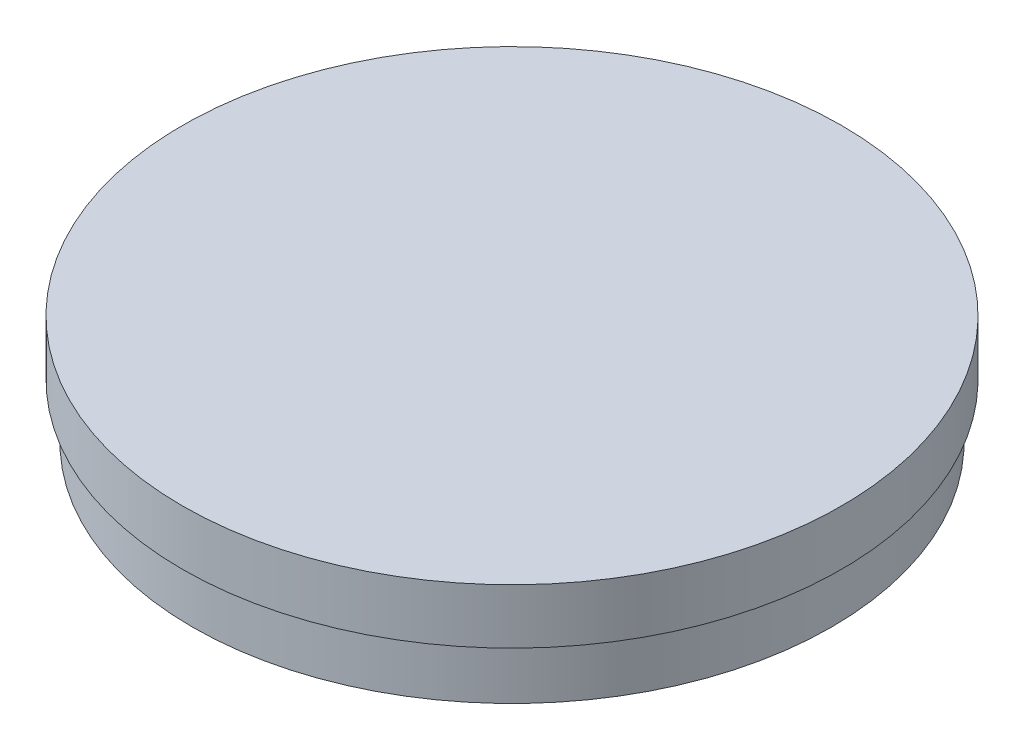
ISO-10303-21;
HEADER;
FILE_DESCRIPTION(('STEP AP214'),'2;1');
FILE_NAME('part.step','',(''),(''),'','','');
FILE_SCHEMA(('AUTOMOTIVE_DESIGN { 1 0 10303 214 1 1 1 1 }'));
ENDSEC;
DATA;
#1=APPLICATION_CONTEXT('core data for automotive mechanical design processes');
#2=APPLICATION_PROTOCOL_DEFINITION('international standard','automotive_design',2000,#1);
#3=PRODUCT_CONTEXT('',#1,'mechanical');
#4=PRODUCT('Part','Part','',(#3));
#5=PRODUCT_RELATED_PRODUCT_CATEGORY('part','',(#4));
#6=PRODUCT_DEFINITION_FORMATION('','',#4);
#7=PRODUCT_DEFINITION_CONTEXT('part definition',#1,'design');
#8=PRODUCT_DEFINITION('design','',#6,#7);
#9=PRODUCT_DEFINITION_SHAPE('','',#8);
#10=(LENGTH_UNIT() NAMED_UNIT(*) SI_UNIT(.MILLI.,.METRE.));
#11=(NAMED_UNIT(*) PLANE_ANGLE_UNIT() SI_UNIT($,.RADIAN.));
#12=(NAMED_UNIT(*) SI_UNIT($,.STERADIAN.) SOLID_ANGLE_UNIT());
#13=UNCERTAINTY_MEASURE_WITH_UNIT(LENGTH_MEASURE(1.E-05),#10,'distance_accuracy_value','');
#14=(GEOMETRIC_REPRESENTATION_CONTEXT(3) GLOBAL_UNCERTAINTY_ASSIGNED_CONTEXT((#13)) GLOBAL_UNIT_ASSIGNED_CONTEXT((#10,
#11,#12)) REPRESENTATION_CONTEXT('',''));
#15=CARTESIAN_POINT('',(0.,0.,0.));
#16=DIRECTION('',(0.,0.,1.));
#17=DIRECTION('',(1.,0.,0.));
#18=AXIS2_PLACEMENT_3D('',#15,#16,#17);
#19=CARTESIAN_POINT('',(0.,12.7,0.));
#20=DIRECTION('',(0.,-1.,0.));
#21=DIRECTION('',(0.,0.,-1.));
#22=AXIS2_PLACEMENT_3D('',#19,#20,#21);
#23=CYLINDRICAL_SURFACE('',#22,76.2);
#24=CARTESIAN_POINT('',(0.,12.7,0.));
#25=DIRECTION('',(0.,1.,0.));
#26=DIRECTION('',(0.,0.,1.));
#27=AXIS2_PLACEMENT_3D('',#24,#25,#26);
#28=CIRCLE('',#27,76.2);
#29=CARTESIAN_POINT('',(0.,12.7,76.2));
#30=VERTEX_POINT('',#29);
#31=EDGE_CURVE('E45',#30,#30,#28,.T.);
#32=ORIENTED_EDGE('',*,*,#31,.F.);
#33=EDGE_LOOP('',(#32));
#34=FACE_BOUND('',#33,.T.);
#35=CARTESIAN_POINT('',(0.,0.,0.));
#36=DIRECTION('',(0.,1.,0.));
#37=DIRECTION('',(0.,0.,1.));
#38=AXIS2_PLACEMENT_3D('',#35,#36,#37);
#39=CIRCLE('',#38,76.2);
#40=CARTESIAN_POINT('',(0.,0.,76.2));
#41=VERTEX_POINT('',#40);
#42=EDGE_CURVE('E40',#41,#41,#39,.T.);
#43=ORIENTED_EDGE('',*,*,#42,.T.);
#44=EDGE_LOOP('',(#43));
#45=FACE_BOUND('',#44,.T.);
#46=ADVANCED_FACE('F37',(#34,#45),#23,.T.);
#47=CARTESIAN_POINT('',(0.,12.7,0.));
#48=DIRECTION('',(0.,1.,0.));
#49=DIRECTION('',(0.,0.,1.));
#50=AXIS2_PLACEMENT_3D('',#47,#48,#49);
#51=PLANE('',#50);
#52=ORIENTED_EDGE('',*,*,#31,.T.);
#53=EDGE_LOOP('',(#52));
#54=FACE_BOUND('',#53,.T.);
#55=ADVANCED_FACE('F65',(#54),#51,.T.);
#56=CARTESIAN_POINT('',(0.,0.,0.));
#57=DIRECTION('',(0.,1.,0.));
#58=DIRECTION('',(0.,0.,1.));
#59=AXIS2_PLACEMENT_3D('',#56,#57,#58);
#60=PLANE('',#59);
#61=CARTESIAN_POINT('',(0.,0.,0.));
#62=DIRECTION('',(0.,-1.,0.));
#63=DIRECTION('',(0.,0.,-1.));
#64=AXIS2_PLACEMENT_3D('',#61,#62,#63);
#65=CIRCLE('',#64,73.914);
#66=CARTESIAN_POINT('',(0.,0.,-73.914));
#67=VERTEX_POINT('',#66);
#68=EDGE_CURVE('E10',#67,#67,#65,.T.);
#69=ORIENTED_EDGE('',*,*,#68,.F.);
#70=EDGE_LOOP('',(#69));
#71=FACE_BOUND('',#70,.T.);
#72=ORIENTED_EDGE('',*,*,#42,.F.);
#73=EDGE_LOOP('',(#72));
#74=FACE_BOUND('',#73,.T.);
#75=ADVANCED_FACE('F62',(#71,#74),#60,.F.);
#76=CARTESIAN_POINT('',(0.,-12.7,0.));
#77=DIRECTION('',(0.,1.,0.));
#78=DIRECTION('',(0.,0.,1.));
#79=AXIS2_PLACEMENT_3D('',#76,#77,#78);
#80=CYLINDRICAL_SURFACE('',#79,73.914);
#81=CARTESIAN_POINT('',(0.,-12.7,0.));
#82=DIRECTION('',(0.,-1.,0.));
#83=DIRECTION('',(0.,0.,-1.));
#84=AXIS2_PLACEMENT_3D('',#81,#82,#83);
#85=CIRCLE('',#84,73.914);
#86=CARTESIAN_POINT('',(0.,-12.7,-73.914));
#87=VERTEX_POINT('',#86);
#88=EDGE_CURVE('E52',#87,#87,#85,.T.);
#89=ORIENTED_EDGE('',*,*,#88,.F.);
#90=EDGE_LOOP('',(#89));
#91=FACE_BOUND('',#90,.T.);
#92=ORIENTED_EDGE('',*,*,#68,.T.);
#93=EDGE_LOOP('',(#92));
#94=FACE_BOUND('',#93,.T.);
#95=ADVANCED_FACE('F64',(#91,#94),#80,.T.);
#96=CARTESIAN_POINT('',(0.,-12.7,0.));
#97=DIRECTION('',(0.,-1.,0.));
#98=DIRECTION('',(0.,0.,-1.));
#99=AXIS2_PLACEMENT_3D('',#96,#97,#98);
#100=PLANE('',#99);
#101=ORIENTED_EDGE('',*,*,#88,.T.);
#102=EDGE_LOOP('',(#101));
#103=FACE_BOUND('',#102,.T.);
#104=ADVANCED_FACE('F72',(#103),#100,.T.);
#105=CLOSED_SHELL('',(#46,#55,#75,#95,#104));
#106=MANIFOLD_SOLID_BREP('B2',#105);
#107=ADVANCED_BREP_SHAPE_REPRESENTATION('',(#18,#106),#14);
#108=SHAPE_DEFINITION_REPRESENTATION(#9,#107);
ENDSEC;
END-ISO-10303-21;
